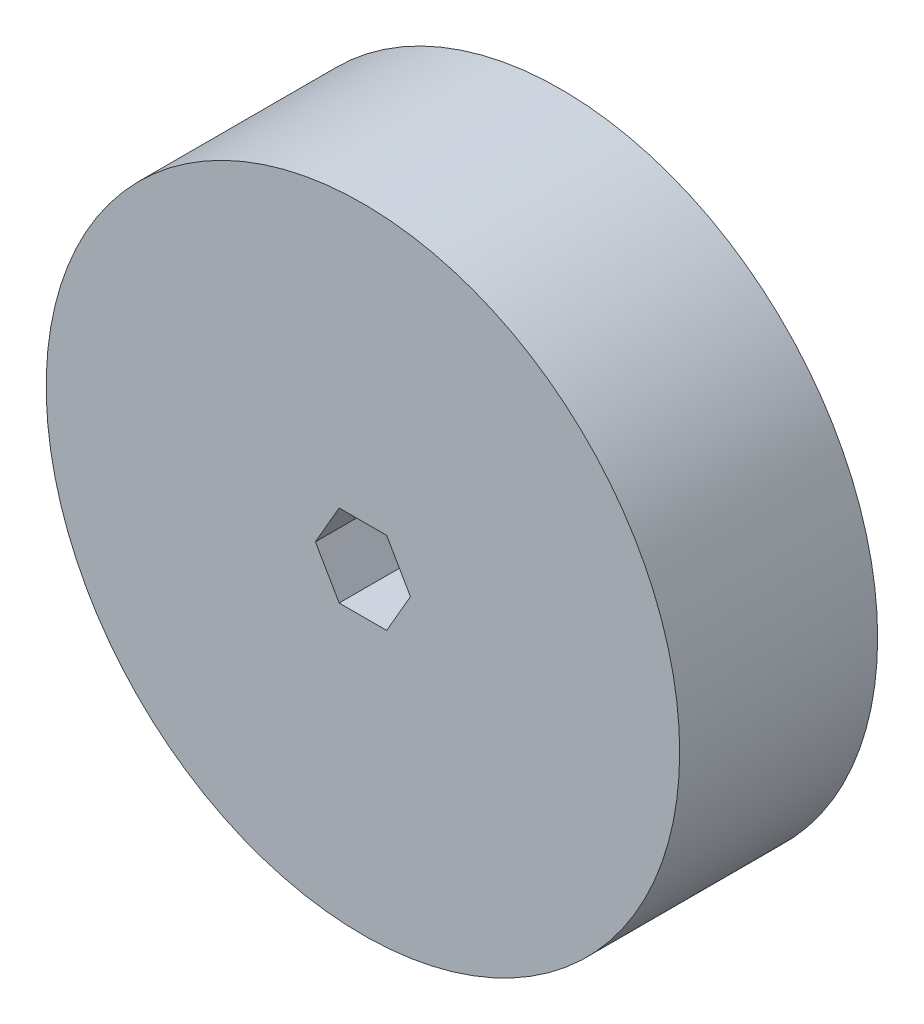
ISO-10303-21;
HEADER;
FILE_DESCRIPTION(('STEP AP214'),'2;1');
FILE_NAME('part.step','',(''),(''),'','','');
FILE_SCHEMA(('AUTOMOTIVE_DESIGN { 1 0 10303 214 1 1 1 1 }'));
ENDSEC;
DATA;
#1=APPLICATION_CONTEXT('core data for automotive mechanical design processes');
#2=APPLICATION_PROTOCOL_DEFINITION('international standard','automotive_design',2000,#1);
#3=PRODUCT_CONTEXT('',#1,'mechanical');
#4=PRODUCT('Part','Part','',(#3));
#5=PRODUCT_RELATED_PRODUCT_CATEGORY('part','',(#4));
#6=PRODUCT_DEFINITION_FORMATION('','',#4);
#7=PRODUCT_DEFINITION_CONTEXT('part definition',#1,'design');
#8=PRODUCT_DEFINITION('design','',#6,#7);
#9=PRODUCT_DEFINITION_SHAPE('','',#8);
#10=(LENGTH_UNIT() NAMED_UNIT(*) SI_UNIT(.MILLI.,.METRE.));
#11=(NAMED_UNIT(*) PLANE_ANGLE_UNIT() SI_UNIT($,.RADIAN.));
#12=(NAMED_UNIT(*) SI_UNIT($,.STERADIAN.) SOLID_ANGLE_UNIT());
#13=UNCERTAINTY_MEASURE_WITH_UNIT(LENGTH_MEASURE(1.E-05),#10,'distance_accuracy_value','');
#14=(GEOMETRIC_REPRESENTATION_CONTEXT(3) GLOBAL_UNCERTAINTY_ASSIGNED_CONTEXT((#13)) GLOBAL_UNIT_ASSIGNED_CONTEXT((#10,
#11,#12)) REPRESENTATION_CONTEXT('',''));
#15=CARTESIAN_POINT('',(0.,0.,0.));
#16=DIRECTION('',(0.,0.,1.));
#17=DIRECTION('',(1.,0.,0.));
#18=AXIS2_PLACEMENT_3D('',#15,#16,#17);
#19=CARTESIAN_POINT('',(0.,0.,13.125));
#20=DIRECTION('',(0.,0.,-1.));
#21=DIRECTION('',(-1.,0.,0.));
#22=AXIS2_PLACEMENT_3D('',#19,#20,#21);
#23=CYLINDRICAL_SURFACE('',#22,18.);
#24=CARTESIAN_POINT('',(0.,0.,13.125));
#25=DIRECTION('',(0.,0.,1.));
#26=DIRECTION('',(1.,0.,0.));
#27=AXIS2_PLACEMENT_3D('',#24,#25,#26);
#28=CIRCLE('',#27,18.);
#29=CARTESIAN_POINT('',(18.,0.,13.125));
#30=VERTEX_POINT('',#29);
#31=EDGE_CURVE('E11',#30,#30,#28,.T.);
#32=ORIENTED_EDGE('',*,*,#31,.F.);
#33=EDGE_LOOP('',(#32));
#34=FACE_BOUND('',#33,.T.);
#35=CARTESIAN_POINT('',(0.,0.,1.875));
#36=DIRECTION('',(0.,0.,1.));
#37=DIRECTION('',(1.,0.,0.));
#38=AXIS2_PLACEMENT_3D('',#35,#36,#37);
#39=CIRCLE('',#38,18.);
#40=CARTESIAN_POINT('',(18.,0.,1.875));
#41=VERTEX_POINT('',#40);
#42=EDGE_CURVE('E47',#41,#41,#39,.T.);
#43=ORIENTED_EDGE('',*,*,#42,.T.);
#44=EDGE_LOOP('',(#43));
#45=FACE_BOUND('',#44,.T.);
#46=ADVANCED_FACE('F44',(#34,#45),#23,.T.);
#47=CARTESIAN_POINT('',(0.,0.,13.125));
#48=DIRECTION('',(0.,0.,1.));
#49=DIRECTION('',(1.,0.,0.));
#50=AXIS2_PLACEMENT_3D('',#47,#48,#49);
#51=PLANE('',#50);
#52=DIRECTION('',(0.5,0.866025403784439,0.));
#53=VECTOR('',#52,1.);
#54=CARTESIAN_POINT('',(1.35,-2.33826859021799,13.125));
#55=LINE('',#54,#53);
#56=CARTESIAN_POINT('',(1.35,-2.33826859021799,13.125));
#57=VERTEX_POINT('',#56);
#58=CARTESIAN_POINT('',(2.7,0.,13.125));
#59=VERTEX_POINT('',#58);
#60=EDGE_CURVE('E59',#57,#59,#55,.T.);
#61=ORIENTED_EDGE('',*,*,#60,.F.);
#62=DIRECTION('',(1.,0.,0.));
#63=VECTOR('',#62,1.);
#64=CARTESIAN_POINT('',(-1.35,-2.33826859021799,13.125));
#65=LINE('',#64,#63);
#66=CARTESIAN_POINT('',(-1.35,-2.33826859021799,13.125));
#67=VERTEX_POINT('',#66);
#68=EDGE_CURVE('E119',#67,#57,#65,.T.);
#69=ORIENTED_EDGE('',*,*,#68,.F.);
#70=DIRECTION('',(0.5,-0.866025403784439,0.));
#71=VECTOR('',#70,1.);
#72=CARTESIAN_POINT('',(-2.7,0.,13.125));
#73=LINE('',#72,#71);
#74=CARTESIAN_POINT('',(-2.7,0.,13.125));
#75=VERTEX_POINT('',#74);
#76=EDGE_CURVE('E123',#75,#67,#73,.T.);
#77=ORIENTED_EDGE('',*,*,#76,.F.);
#78=DIRECTION('',(-0.5,-0.866025403784439,0.));
#79=VECTOR('',#78,1.);
#80=CARTESIAN_POINT('',(-1.35,2.33826859021799,13.125));
#81=LINE('',#80,#79);
#82=CARTESIAN_POINT('',(-1.35,2.33826859021799,13.125));
#83=VERTEX_POINT('',#82);
#84=EDGE_CURVE('E146',#83,#75,#81,.T.);
#85=ORIENTED_EDGE('',*,*,#84,.F.);
#86=DIRECTION('',(-1.,0.,0.));
#87=VECTOR('',#86,1.);
#88=CARTESIAN_POINT('',(1.35,2.33826859021799,13.125));
#89=LINE('',#88,#87);
#90=CARTESIAN_POINT('',(1.35,2.33826859021799,13.125));
#91=VERTEX_POINT('',#90);
#92=EDGE_CURVE('E142',#91,#83,#89,.T.);
#93=ORIENTED_EDGE('',*,*,#92,.F.);
#94=DIRECTION('',(-0.5,0.866025403784439,0.));
#95=VECTOR('',#94,1.);
#96=CARTESIAN_POINT('',(2.7,0.,13.125));
#97=LINE('',#96,#95);
#98=EDGE_CURVE('E139',#59,#91,#97,.T.);
#99=ORIENTED_EDGE('',*,*,#98,.F.);
#100=EDGE_LOOP('',(#61,#69,#77,#85,#93,#99));
#101=FACE_BOUND('',#100,.T.);
#102=ORIENTED_EDGE('',*,*,#31,.T.);
#103=EDGE_LOOP('',(#102));
#104=FACE_BOUND('',#103,.T.);
#105=ADVANCED_FACE('F170',(#101,#104),#51,.T.);
#106=CARTESIAN_POINT('',(0.,0.,1.875));
#107=DIRECTION('',(0.,0.,1.));
#108=DIRECTION('',(1.,0.,0.));
#109=AXIS2_PLACEMENT_3D('',#106,#107,#108);
#110=PLANE('',#109);
#111=DIRECTION('',(1.,0.,0.));
#112=VECTOR('',#111,1.);
#113=CARTESIAN_POINT('',(-1.35,-2.33826859021799,1.875));
#114=LINE('',#113,#112);
#115=CARTESIAN_POINT('',(-1.35,-2.33826859021799,1.875));
#116=VERTEX_POINT('',#115);
#117=CARTESIAN_POINT('',(1.35,-2.33826859021799,1.875));
#118=VERTEX_POINT('',#117);
#119=EDGE_CURVE('E106',#116,#118,#114,.T.);
#120=ORIENTED_EDGE('',*,*,#119,.T.);
#121=DIRECTION('',(0.5,0.866025403784439,0.));
#122=VECTOR('',#121,1.);
#123=CARTESIAN_POINT('',(1.35,-2.33826859021799,1.875));
#124=LINE('',#123,#122);
#125=CARTESIAN_POINT('',(2.7,0.,1.875));
#126=VERTEX_POINT('',#125);
#127=EDGE_CURVE('E99',#118,#126,#124,.T.);
#128=ORIENTED_EDGE('',*,*,#127,.T.);
#129=DIRECTION('',(-0.5,0.866025403784439,0.));
#130=VECTOR('',#129,1.);
#131=CARTESIAN_POINT('',(2.7,0.,1.875));
#132=LINE('',#131,#130);
#133=CARTESIAN_POINT('',(1.35,2.33826859021799,1.875));
#134=VERTEX_POINT('',#133);
#135=EDGE_CURVE('E109',#126,#134,#132,.T.);
#136=ORIENTED_EDGE('',*,*,#135,.T.);
#137=DIRECTION('',(-1.,0.,0.));
#138=VECTOR('',#137,1.);
#139=CARTESIAN_POINT('',(1.35,2.33826859021799,1.875));
#140=LINE('',#139,#138);
#141=CARTESIAN_POINT('',(-1.35,2.33826859021799,1.875));
#142=VERTEX_POINT('',#141);
#143=EDGE_CURVE('E67',#134,#142,#140,.T.);
#144=ORIENTED_EDGE('',*,*,#143,.T.);
#145=DIRECTION('',(-0.5,-0.866025403784439,0.));
#146=VECTOR('',#145,1.);
#147=CARTESIAN_POINT('',(-1.35,2.33826859021799,1.875));
#148=LINE('',#147,#146);
#149=CARTESIAN_POINT('',(-2.7,0.,1.875));
#150=VERTEX_POINT('',#149);
#151=EDGE_CURVE('E128',#142,#150,#148,.T.);
#152=ORIENTED_EDGE('',*,*,#151,.T.);
#153=DIRECTION('',(0.5,-0.866025403784439,0.));
#154=VECTOR('',#153,1.);
#155=CARTESIAN_POINT('',(-2.7,0.,1.875));
#156=LINE('',#155,#154);
#157=EDGE_CURVE('E132',#150,#116,#156,.T.);
#158=ORIENTED_EDGE('',*,*,#157,.T.);
#159=EDGE_LOOP('',(#120,#128,#136,#144,#152,#158));
#160=FACE_BOUND('',#159,.T.);
#161=ORIENTED_EDGE('',*,*,#42,.F.);
#162=EDGE_LOOP('',(#161));
#163=FACE_BOUND('',#162,.T.);
#164=ADVANCED_FACE('F114',(#160,#163),#110,.F.);
#165=CARTESIAN_POINT('',(1.35,-2.33826859021799,1.875));
#166=DIRECTION('',(0.866025403784439,-0.5,0.));
#167=DIRECTION('',(0.5,0.866025403784439,0.));
#168=AXIS2_PLACEMENT_3D('',#165,#166,#167);
#169=PLANE('',#168);
#170=ORIENTED_EDGE('',*,*,#60,.T.);
#171=DIRECTION('',(0.,0.,1.));
#172=VECTOR('',#171,1.);
#173=CARTESIAN_POINT('',(2.7,0.,1.875));
#174=LINE('',#173,#172);
#175=EDGE_CURVE('E95',#126,#59,#174,.T.);
#176=ORIENTED_EDGE('',*,*,#175,.F.);
#177=ORIENTED_EDGE('',*,*,#127,.F.);
#178=DIRECTION('',(0.,0.,1.));
#179=VECTOR('',#178,1.);
#180=CARTESIAN_POINT('',(1.35,-2.33826859021799,1.875));
#181=LINE('',#180,#179);
#182=EDGE_CURVE('E153',#118,#57,#181,.T.);
#183=ORIENTED_EDGE('',*,*,#182,.T.);
#184=EDGE_LOOP('',(#170,#176,#177,#183));
#185=FACE_BOUND('',#184,.T.);
#186=ADVANCED_FACE('F97',(#185),#169,.F.);
#187=CARTESIAN_POINT('',(-1.35,-2.33826859021799,1.875));
#188=DIRECTION('',(0.,-1.,0.));
#189=DIRECTION('',(0.,0.,-1.));
#190=AXIS2_PLACEMENT_3D('',#187,#188,#189);
#191=PLANE('',#190);
#192=ORIENTED_EDGE('',*,*,#68,.T.);
#193=ORIENTED_EDGE('',*,*,#182,.F.);
#194=ORIENTED_EDGE('',*,*,#119,.F.);
#195=DIRECTION('',(0.,0.,1.));
#196=VECTOR('',#195,1.);
#197=CARTESIAN_POINT('',(-1.35,-2.33826859021799,1.875));
#198=LINE('',#197,#196);
#199=EDGE_CURVE('E156',#116,#67,#198,.T.);
#200=ORIENTED_EDGE('',*,*,#199,.T.);
#201=EDGE_LOOP('',(#192,#193,#194,#200));
#202=FACE_BOUND('',#201,.T.);
#203=ADVANCED_FACE('F181',(#202),#191,.F.);
#204=CARTESIAN_POINT('',(-2.7,0.,1.875));
#205=DIRECTION('',(-0.866025403784439,-0.5,0.));
#206=DIRECTION('',(0.5,-0.866025403784439,0.));
#207=AXIS2_PLACEMENT_3D('',#204,#205,#206);
#208=PLANE('',#207);
#209=ORIENTED_EDGE('',*,*,#76,.T.);
#210=ORIENTED_EDGE('',*,*,#199,.F.);
#211=ORIENTED_EDGE('',*,*,#157,.F.);
#212=DIRECTION('',(0.,0.,1.));
#213=VECTOR('',#212,1.);
#214=CARTESIAN_POINT('',(-2.7,0.,1.875));
#215=LINE('',#214,#213);
#216=EDGE_CURVE('E159',#150,#75,#215,.T.);
#217=ORIENTED_EDGE('',*,*,#216,.T.);
#218=EDGE_LOOP('',(#209,#210,#211,#217));
#219=FACE_BOUND('',#218,.T.);
#220=ADVANCED_FACE('F179',(#219),#208,.F.);
#221=CARTESIAN_POINT('',(-1.35,2.33826859021799,1.875));
#222=DIRECTION('',(-0.866025403784439,0.5,0.));
#223=DIRECTION('',(-0.5,-0.866025403784439,0.));
#224=AXIS2_PLACEMENT_3D('',#221,#222,#223);
#225=PLANE('',#224);
#226=ORIENTED_EDGE('',*,*,#84,.T.);
#227=ORIENTED_EDGE('',*,*,#216,.F.);
#228=ORIENTED_EDGE('',*,*,#151,.F.);
#229=DIRECTION('',(0.,0.,1.));
#230=VECTOR('',#229,1.);
#231=CARTESIAN_POINT('',(-1.35,2.33826859021799,1.875));
#232=LINE('',#231,#230);
#233=EDGE_CURVE('E162',#142,#83,#232,.T.);
#234=ORIENTED_EDGE('',*,*,#233,.T.);
#235=EDGE_LOOP('',(#226,#227,#228,#234));
#236=FACE_BOUND('',#235,.T.);
#237=ADVANCED_FACE('F175',(#236),#225,.F.);
#238=CARTESIAN_POINT('',(1.35,2.33826859021799,1.875));
#239=DIRECTION('',(0.,1.,0.));
#240=DIRECTION('',(0.,0.,1.));
#241=AXIS2_PLACEMENT_3D('',#238,#239,#240);
#242=PLANE('',#241);
#243=ORIENTED_EDGE('',*,*,#92,.T.);
#244=ORIENTED_EDGE('',*,*,#233,.F.);
#245=ORIENTED_EDGE('',*,*,#143,.F.);
#246=DIRECTION('',(0.,0.,1.));
#247=VECTOR('',#246,1.);
#248=CARTESIAN_POINT('',(1.35,2.33826859021799,1.875));
#249=LINE('',#248,#247);
#250=EDGE_CURVE('E105',#134,#91,#249,.T.);
#251=ORIENTED_EDGE('',*,*,#250,.T.);
#252=EDGE_LOOP('',(#243,#244,#245,#251));
#253=FACE_BOUND('',#252,.T.);
#254=ADVANCED_FACE('F166',(#253),#242,.F.);
#255=CARTESIAN_POINT('',(2.7,0.,1.875));
#256=DIRECTION('',(0.866025403784439,0.5,0.));
#257=DIRECTION('',(-0.5,0.866025403784439,0.));
#258=AXIS2_PLACEMENT_3D('',#255,#256,#257);
#259=PLANE('',#258);
#260=ORIENTED_EDGE('',*,*,#98,.T.);
#261=ORIENTED_EDGE('',*,*,#250,.F.);
#262=ORIENTED_EDGE('',*,*,#135,.F.);
#263=ORIENTED_EDGE('',*,*,#175,.T.);
#264=EDGE_LOOP('',(#260,#261,#262,#263));
#265=FACE_BOUND('',#264,.T.);
#266=ADVANCED_FACE('F110',(#265),#259,.F.);
#267=CLOSED_SHELL('',(#46,#105,#164,#186,#203,#220,#237,#254,#266));
#268=MANIFOLD_SOLID_BREP('B2',#267);
#269=ADVANCED_BREP_SHAPE_REPRESENTATION('',(#18,#268),#14);
#270=SHAPE_DEFINITION_REPRESENTATION(#9,#269);
ENDSEC;
END-ISO-10303-21;
